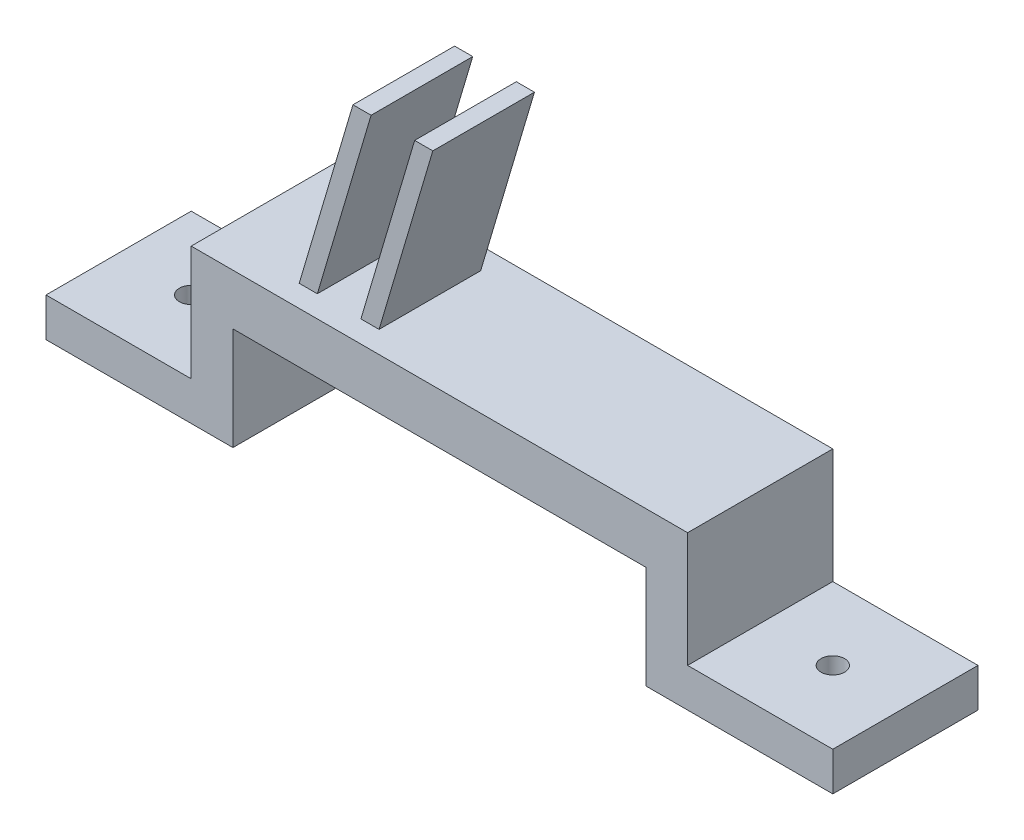
ISO-10303-21;
HEADER;
FILE_DESCRIPTION(('STEP AP214'),'2;1');
FILE_NAME('part.step','',(''),(''),'','','');
FILE_SCHEMA(('AUTOMOTIVE_DESIGN { 1 0 10303 214 1 1 1 1 }'));
ENDSEC;
DATA;
#1=APPLICATION_CONTEXT('core data for automotive mechanical design processes');
#2=APPLICATION_PROTOCOL_DEFINITION('international standard','automotive_design',2000,#1);
#3=PRODUCT_CONTEXT('',#1,'mechanical');
#4=PRODUCT('Part','Part','',(#3));
#5=PRODUCT_RELATED_PRODUCT_CATEGORY('part','',(#4));
#6=PRODUCT_DEFINITION_FORMATION('','',#4);
#7=PRODUCT_DEFINITION_CONTEXT('part definition',#1,'design');
#8=PRODUCT_DEFINITION('design','',#6,#7);
#9=PRODUCT_DEFINITION_SHAPE('','',#8);
#10=(LENGTH_UNIT() NAMED_UNIT(*) SI_UNIT(.MILLI.,.METRE.));
#11=(NAMED_UNIT(*) PLANE_ANGLE_UNIT() SI_UNIT($,.RADIAN.));
#12=(NAMED_UNIT(*) SI_UNIT($,.STERADIAN.) SOLID_ANGLE_UNIT());
#13=UNCERTAINTY_MEASURE_WITH_UNIT(LENGTH_MEASURE(1.E-05),#10,'distance_accuracy_value','');
#14=(GEOMETRIC_REPRESENTATION_CONTEXT(3) GLOBAL_UNCERTAINTY_ASSIGNED_CONTEXT((#13)) GLOBAL_UNIT_ASSIGNED_CONTEXT((#10,
#11,#12)) REPRESENTATION_CONTEXT('',''));
#15=CARTESIAN_POINT('',(0.,0.,0.));
#16=DIRECTION('',(0.,0.,1.));
#17=DIRECTION('',(1.,0.,0.));
#18=AXIS2_PLACEMENT_3D('',#15,#16,#17);
#19=CARTESIAN_POINT('',(-20.1082004555809,0.,16.));
#20=DIRECTION('',(1.,0.,0.));
#21=DIRECTION('',(0.,0.,-1.));
#22=AXIS2_PLACEMENT_3D('',#19,#20,#21);
#23=PLANE('',#22);
#24=DIRECTION('',(0.,0.,-1.));
#25=VECTOR('',#24,1.);
#26=CARTESIAN_POINT('',(-20.1082004555809,12.6633257403189,16.));
#27=LINE('',#26,#25);
#28=CARTESIAN_POINT('',(-20.1082004555809,12.6633257403189,16.));
#29=VERTEX_POINT('',#28);
#30=CARTESIAN_POINT('',(-20.1082004555809,12.6633257403189,0.));
#31=VERTEX_POINT('',#30);
#32=EDGE_CURVE('E362',#29,#31,#27,.T.);
#33=ORIENTED_EDGE('',*,*,#32,.T.);
#34=DIRECTION('',(0.,-1.,0.));
#35=VECTOR('',#34,1.);
#36=CARTESIAN_POINT('',(-20.1082004555809,0.,0.));
#37=LINE('',#36,#35);
#38=CARTESIAN_POINT('',(-20.1082004555809,0.,0.));
#39=VERTEX_POINT('',#38);
#40=EDGE_CURVE('E356',#31,#39,#37,.T.);
#41=ORIENTED_EDGE('',*,*,#40,.T.);
#42=DIRECTION('',(0.,0.,1.));
#43=VECTOR('',#42,1.);
#44=CARTESIAN_POINT('',(-20.1082004555809,0.,0.));
#45=LINE('',#44,#43);
#46=CARTESIAN_POINT('',(-20.1082004555809,0.,16.));
#47=VERTEX_POINT('',#46);
#48=EDGE_CURVE('E311',#39,#47,#45,.T.);
#49=ORIENTED_EDGE('',*,*,#48,.T.);
#50=DIRECTION('',(0.,-1.,0.));
#51=VECTOR('',#50,1.);
#52=CARTESIAN_POINT('',(-20.1082004555809,0.,16.));
#53=LINE('',#52,#51);
#54=EDGE_CURVE('E341',#29,#47,#53,.T.);
#55=ORIENTED_EDGE('',*,*,#54,.F.);
#56=EDGE_LOOP('',(#33,#41,#49,#55));
#57=FACE_BOUND('',#56,.T.);
#58=ADVANCED_FACE('F95',(#57),#23,.F.);
#59=CARTESIAN_POINT('',(-20.1082004555809,32.6633257403189,2.4));
#60=DIRECTION('',(0.,0.,1.));
#61=DIRECTION('',(1.,0.,0.));
#62=AXIS2_PLACEMENT_3D('',#59,#60,#61);
#63=PLANE('',#62);
#64=DIRECTION('',(0.284015344703926,0.958819734868192,0.));
#65=VECTOR('',#64,1.);
#66=CARTESIAN_POINT('',(-4.08945433974437,27.9183569684367,2.4));
#67=LINE('',#66,#65);
#68=CARTESIAN_POINT('',(-8.60820045558087,12.6633257403189,2.4));
#69=VERTEX_POINT('',#68);
#70=CARTESIAN_POINT('',(-2.68393055633918,32.6633257403189,2.4));
#71=VERTEX_POINT('',#70);
#72=EDGE_CURVE('E253',#69,#71,#67,.T.);
#73=ORIENTED_EDGE('',*,*,#72,.F.);
#74=DIRECTION('',(-1.,0.,0.));
#75=VECTOR('',#74,1.);
#76=CARTESIAN_POINT('',(-20.1082004555809,12.6633257403189,2.4));
#77=LINE('',#76,#75);
#78=CARTESIAN_POINT('',(-10.6082004555809,12.6633257403189,2.4));
#79=VERTEX_POINT('',#78);
#80=EDGE_CURVE('E246',#69,#79,#77,.T.);
#81=ORIENTED_EDGE('',*,*,#80,.T.);
#82=DIRECTION('',(0.28401534470392,0.958819734868194,0.));
#83=VECTOR('',#82,1.);
#84=CARTESIAN_POINT('',(-5.92812490768987,28.4629960034518,2.4));
#85=LINE('',#84,#83);
#86=CARTESIAN_POINT('',(-4.68393055633933,32.6633257403189,2.4));
#87=VERTEX_POINT('',#86);
#88=EDGE_CURVE('E229',#79,#87,#85,.T.);
#89=ORIENTED_EDGE('',*,*,#88,.T.);
#90=DIRECTION('',(-1.,0.,0.));
#91=VECTOR('',#90,1.);
#92=CARTESIAN_POINT('',(-20.1082004555809,32.6633257403189,2.4));
#93=LINE('',#92,#91);
#94=EDGE_CURVE('E386',#71,#87,#93,.T.);
#95=ORIENTED_EDGE('',*,*,#94,.F.);
#96=EDGE_LOOP('',(#73,#81,#89,#95));
#97=FACE_BOUND('',#96,.T.);
#98=ADVANCED_FACE('F252',(#97),#63,.F.);
#99=CARTESIAN_POINT('',(-1.80820045558087,12.6633257403189,2.4));
#100=VERTEX_POINT('',#99);
#101=CARTESIAN_POINT('',(-3.80820045558087,12.6633257403189,2.4));
#102=VERTEX_POINT('',#101);
#103=EDGE_CURVE('E254',#100,#102,#77,.T.);
#104=ORIENTED_EDGE('',*,*,#103,.T.);
#105=DIRECTION('',(0.28401534470392,0.958819734868194,0.));
#106=VECTOR('',#105,1.);
#107=CARTESIAN_POINT('',(0.323355023324586,26.6112232844008,2.4));
#108=LINE('',#107,#106);
#109=CARTESIAN_POINT('',(2.11606944366067,32.6633257403189,2.4));
#110=VERTEX_POINT('',#109);
#111=EDGE_CURVE('E389',#102,#110,#108,.T.);
#112=ORIENTED_EDGE('',*,*,#111,.T.);
#113=CARTESIAN_POINT('',(4.11606944366067,32.6633257403189,2.4));
#114=VERTEX_POINT('',#113);
#115=EDGE_CURVE('E379',#114,#110,#93,.T.);
#116=ORIENTED_EDGE('',*,*,#115,.F.);
#117=DIRECTION('',(0.28401534470392,0.958819734868194,0.));
#118=VECTOR('',#117,1.);
#119=CARTESIAN_POINT('',(2.16202559127002,26.0665842493857,2.4));
#120=LINE('',#119,#118);
#121=EDGE_CURVE('E392',#100,#114,#120,.T.);
#122=ORIENTED_EDGE('',*,*,#121,.F.);
#123=EDGE_LOOP('',(#104,#112,#116,#122));
#124=FACE_BOUND('',#123,.T.);
#125=ADVANCED_FACE('F408',(#124),#63,.F.);
#126=CARTESIAN_POINT('',(-20.1082004555809,32.6633257403189,13.6));
#127=DIRECTION('',(0.,0.,-1.));
#128=DIRECTION('',(-1.,0.,0.));
#129=AXIS2_PLACEMENT_3D('',#126,#127,#128);
#130=PLANE('',#129);
#131=DIRECTION('',(-0.284015344703926,-0.958819734868192,0.));
#132=VECTOR('',#131,1.);
#133=CARTESIAN_POINT('',(-4.08945433974437,27.9183569684367,13.6));
#134=LINE('',#133,#132);
#135=CARTESIAN_POINT('',(-2.68393055633918,32.6633257403189,13.6));
#136=VERTEX_POINT('',#135);
#137=CARTESIAN_POINT('',(-8.60820045558087,12.6633257403189,13.6));
#138=VERTEX_POINT('',#137);
#139=EDGE_CURVE('E258',#136,#138,#134,.T.);
#140=ORIENTED_EDGE('',*,*,#139,.F.);
#141=DIRECTION('',(1.,0.,0.));
#142=VECTOR('',#141,1.);
#143=CARTESIAN_POINT('',(-20.1082004555809,32.6633257403189,13.6));
#144=LINE('',#143,#142);
#145=CARTESIAN_POINT('',(-4.68393055633933,32.6633257403189,13.6));
#146=VERTEX_POINT('',#145);
#147=EDGE_CURVE('E270',#146,#136,#144,.T.);
#148=ORIENTED_EDGE('',*,*,#147,.F.);
#149=DIRECTION('',(-0.28401534470392,-0.958819734868194,0.));
#150=VECTOR('',#149,1.);
#151=CARTESIAN_POINT('',(-5.92812490768987,28.4629960034518,13.6));
#152=LINE('',#151,#150);
#153=CARTESIAN_POINT('',(-10.6082004555809,12.6633257403189,13.6));
#154=VERTEX_POINT('',#153);
#155=EDGE_CURVE('E118',#146,#154,#152,.T.);
#156=ORIENTED_EDGE('',*,*,#155,.T.);
#157=DIRECTION('',(1.,0.,0.));
#158=VECTOR('',#157,1.);
#159=CARTESIAN_POINT('',(-20.1082004555809,12.6633257403189,13.6));
#160=LINE('',#159,#158);
#161=EDGE_CURVE('E248',#154,#138,#160,.T.);
#162=ORIENTED_EDGE('',*,*,#161,.T.);
#163=EDGE_LOOP('',(#140,#148,#156,#162));
#164=FACE_BOUND('',#163,.T.);
#165=ADVANCED_FACE('F579',(#164),#130,.F.);
#166=CARTESIAN_POINT('',(2.11606944366067,32.6633257403189,13.6));
#167=VERTEX_POINT('',#166);
#168=CARTESIAN_POINT('',(4.11606944366067,32.6633257403189,13.6));
#169=VERTEX_POINT('',#168);
#170=EDGE_CURVE('E262',#167,#169,#144,.T.);
#171=ORIENTED_EDGE('',*,*,#170,.F.);
#172=DIRECTION('',(-0.28401534470392,-0.958819734868194,0.));
#173=VECTOR('',#172,1.);
#174=CARTESIAN_POINT('',(0.323355023324586,26.6112232844008,13.6));
#175=LINE('',#174,#173);
#176=CARTESIAN_POINT('',(-3.80820045558087,12.6633257403189,13.6));
#177=VERTEX_POINT('',#176);
#178=EDGE_CURVE('E110',#167,#177,#175,.T.);
#179=ORIENTED_EDGE('',*,*,#178,.T.);
#180=CARTESIAN_POINT('',(-1.80820045558087,12.6633257403189,13.6));
#181=VERTEX_POINT('',#180);
#182=EDGE_CURVE('E257',#177,#181,#160,.T.);
#183=ORIENTED_EDGE('',*,*,#182,.T.);
#184=DIRECTION('',(-0.28401534470392,-0.958819734868194,0.));
#185=VECTOR('',#184,1.);
#186=CARTESIAN_POINT('',(2.16202559127002,26.0665842493857,13.6));
#187=LINE('',#186,#185);
#188=EDGE_CURVE('E238',#169,#181,#187,.T.);
#189=ORIENTED_EDGE('',*,*,#188,.F.);
#190=EDGE_LOOP('',(#171,#179,#183,#189));
#191=FACE_BOUND('',#190,.T.);
#192=ADVANCED_FACE('F383',(#191),#130,.F.);
#193=CARTESIAN_POINT('',(0.,32.6633257403189,0.));
#194=DIRECTION('',(0.,-1.,0.));
#195=DIRECTION('',(0.,0.,-1.));
#196=AXIS2_PLACEMENT_3D('',#193,#194,#195);
#197=PLANE('',#196);
#198=DIRECTION('',(0.,0.,1.));
#199=VECTOR('',#198,1.);
#200=CARTESIAN_POINT('',(-2.68393055633918,32.6633257403189,0.));
#201=LINE('',#200,#199);
#202=EDGE_CURVE('E12',#71,#136,#201,.T.);
#203=ORIENTED_EDGE('',*,*,#202,.F.);
#204=ORIENTED_EDGE('',*,*,#94,.T.);
#205=DIRECTION('',(0.,0.,1.));
#206=VECTOR('',#205,1.);
#207=CARTESIAN_POINT('',(-4.68393055633933,32.6633257403189,0.));
#208=LINE('',#207,#206);
#209=EDGE_CURVE('E233',#87,#146,#208,.T.);
#210=ORIENTED_EDGE('',*,*,#209,.T.);
#211=ORIENTED_EDGE('',*,*,#147,.T.);
#212=EDGE_LOOP('',(#203,#204,#210,#211));
#213=FACE_BOUND('',#212,.T.);
#214=ADVANCED_FACE('F598',(#213),#197,.F.);
#215=ORIENTED_EDGE('',*,*,#115,.T.);
#216=DIRECTION('',(0.,0.,1.));
#217=VECTOR('',#216,1.);
#218=CARTESIAN_POINT('',(2.11606944366067,32.6633257403189,0.));
#219=LINE('',#218,#217);
#220=EDGE_CURVE('E103',#110,#167,#219,.T.);
#221=ORIENTED_EDGE('',*,*,#220,.T.);
#222=ORIENTED_EDGE('',*,*,#170,.T.);
#223=DIRECTION('',(0.,0.,1.));
#224=VECTOR('',#223,1.);
#225=CARTESIAN_POINT('',(4.11606944366067,32.6633257403189,0.));
#226=LINE('',#225,#224);
#227=EDGE_CURVE('E371',#114,#169,#226,.T.);
#228=ORIENTED_EDGE('',*,*,#227,.F.);
#229=EDGE_LOOP('',(#215,#221,#222,#228));
#230=FACE_BOUND('',#229,.T.);
#231=ADVANCED_FACE('F376',(#230),#197,.F.);
#232=CARTESIAN_POINT('',(29.9917995444191,0.,16.));
#233=DIRECTION('',(1.,0.,0.));
#234=DIRECTION('',(0.,0.,-1.));
#235=AXIS2_PLACEMENT_3D('',#232,#233,#234);
#236=PLANE('',#235);
#237=DIRECTION('',(0.,-1.,0.));
#238=VECTOR('',#237,1.);
#239=CARTESIAN_POINT('',(29.9917995444191,0.,16.));
#240=LINE('',#239,#238);
#241=CARTESIAN_POINT('',(29.9917995444191,7.06332574031891,16.));
#242=VERTEX_POINT('',#241);
#243=CARTESIAN_POINT('',(29.9917995444191,-4.26667425968109,16.));
#244=VERTEX_POINT('',#243);
#245=EDGE_CURVE('E331',#242,#244,#240,.T.);
#246=ORIENTED_EDGE('',*,*,#245,.F.);
#247=DIRECTION('',(0.,0.,1.));
#248=VECTOR('',#247,1.);
#249=CARTESIAN_POINT('',(29.9917995444191,7.06332574031891,16.));
#250=LINE('',#249,#248);
#251=CARTESIAN_POINT('',(29.9917995444191,7.06332574031891,0.));
#252=VERTEX_POINT('',#251);
#253=EDGE_CURVE('E273',#252,#242,#250,.T.);
#254=ORIENTED_EDGE('',*,*,#253,.F.);
#255=DIRECTION('',(0.,-1.,0.));
#256=VECTOR('',#255,1.);
#257=CARTESIAN_POINT('',(29.9917995444191,0.,0.));
#258=LINE('',#257,#256);
#259=CARTESIAN_POINT('',(29.9917995444191,-4.26667425968109,0.));
#260=VERTEX_POINT('',#259);
#261=EDGE_CURVE('E330',#252,#260,#258,.T.);
#262=ORIENTED_EDGE('',*,*,#261,.T.);
#263=DIRECTION('',(0.,0.,-1.));
#264=VECTOR('',#263,1.);
#265=CARTESIAN_POINT('',(29.9917995444191,-4.26667425968109,16.));
#266=LINE('',#265,#264);
#267=EDGE_CURVE('E367',#244,#260,#266,.T.);
#268=ORIENTED_EDGE('',*,*,#267,.F.);
#269=EDGE_LOOP('',(#246,#254,#262,#268));
#270=FACE_BOUND('',#269,.T.);
#271=ADVANCED_FACE('F97',(#270),#236,.F.);
#272=CARTESIAN_POINT('',(0.,-4.26667425968109,16.));
#273=DIRECTION('',(0.,1.,0.));
#274=DIRECTION('',(0.,0.,1.));
#275=AXIS2_PLACEMENT_3D('',#272,#273,#274);
#276=PLANE('',#275);
#277=CARTESIAN_POINT('',(42.5917995444191,-4.26667425968109,8.));
#278=DIRECTION('',(0.,1.,0.));
#279=DIRECTION('',(0.,0.,1.));
#280=AXIS2_PLACEMENT_3D('',#277,#278,#279);
#281=CIRCLE('',#280,1.3);
#282=CARTESIAN_POINT('',(42.5917995444191,-4.26667425968109,9.30000000000001));
#283=VERTEX_POINT('',#282);
#284=EDGE_CURVE('E288',#283,#283,#281,.T.);
#285=ORIENTED_EDGE('',*,*,#284,.T.);
#286=EDGE_LOOP('',(#285));
#287=FACE_BOUND('',#286,.T.);
#288=DIRECTION('',(1.,0.,0.));
#289=VECTOR('',#288,1.);
#290=CARTESIAN_POINT('',(0.,-4.26667425968109,0.));
#291=LINE('',#290,#289);
#292=CARTESIAN_POINT('',(50.5917995444191,-4.26667425968109,0.));
#293=VERTEX_POINT('',#292);
#294=EDGE_CURVE('E348',#260,#293,#291,.T.);
#295=ORIENTED_EDGE('',*,*,#294,.T.);
#296=DIRECTION('',(0.,0.,-1.));
#297=VECTOR('',#296,1.);
#298=CARTESIAN_POINT('',(50.5917995444191,-4.26667425968109,0.));
#299=LINE('',#298,#297);
#300=CARTESIAN_POINT('',(50.5917995444191,-4.26667425968109,16.));
#301=VERTEX_POINT('',#300);
#302=EDGE_CURVE('E300',#301,#293,#299,.T.);
#303=ORIENTED_EDGE('',*,*,#302,.F.);
#304=DIRECTION('',(1.,0.,0.));
#305=VECTOR('',#304,1.);
#306=CARTESIAN_POINT('',(0.,-4.26667425968109,16.));
#307=LINE('',#306,#305);
#308=EDGE_CURVE('E333',#244,#301,#307,.T.);
#309=ORIENTED_EDGE('',*,*,#308,.F.);
#310=ORIENTED_EDGE('',*,*,#267,.T.);
#311=EDGE_LOOP('',(#295,#303,#309,#310));
#312=FACE_BOUND('',#311,.T.);
#313=ADVANCED_FACE('F434',(#287,#312),#276,.F.);
#314=CARTESIAN_POINT('',(34.5917995444191,0.,16.));
#315=DIRECTION('',(1.,0.,0.));
#316=DIRECTION('',(0.,0.,-1.));
#317=AXIS2_PLACEMENT_3D('',#314,#315,#316);
#318=PLANE('',#317);
#319=DIRECTION('',(0.,0.,1.));
#320=VECTOR('',#319,1.);
#321=CARTESIAN_POINT('',(34.5917995444191,0.,0.));
#322=LINE('',#321,#320);
#323=CARTESIAN_POINT('',(34.5917995444191,0.,0.));
#324=VERTEX_POINT('',#323);
#325=CARTESIAN_POINT('',(34.5917995444191,0.,16.));
#326=VERTEX_POINT('',#325);
#327=EDGE_CURVE('E291',#324,#326,#322,.T.);
#328=ORIENTED_EDGE('',*,*,#327,.F.);
#329=DIRECTION('',(0.,-1.,0.));
#330=VECTOR('',#329,1.);
#331=CARTESIAN_POINT('',(34.5917995444191,0.,0.));
#332=LINE('',#331,#330);
#333=CARTESIAN_POINT('',(34.5917995444191,12.6633257403189,0.));
#334=VERTEX_POINT('',#333);
#335=EDGE_CURVE('E350',#334,#324,#332,.T.);
#336=ORIENTED_EDGE('',*,*,#335,.F.);
#337=DIRECTION('',(0.,0.,-1.));
#338=VECTOR('',#337,1.);
#339=CARTESIAN_POINT('',(34.5917995444191,12.6633257403189,16.));
#340=LINE('',#339,#338);
#341=CARTESIAN_POINT('',(34.5917995444191,12.6633257403189,16.));
#342=VERTEX_POINT('',#341);
#343=EDGE_CURVE('E364',#342,#334,#340,.T.);
#344=ORIENTED_EDGE('',*,*,#343,.F.);
#345=DIRECTION('',(0.,-1.,0.));
#346=VECTOR('',#345,1.);
#347=CARTESIAN_POINT('',(34.5917995444191,0.,16.));
#348=LINE('',#347,#346);
#349=EDGE_CURVE('E336',#342,#326,#348,.T.);
#350=ORIENTED_EDGE('',*,*,#349,.T.);
#351=EDGE_LOOP('',(#328,#336,#344,#350));
#352=FACE_BOUND('',#351,.T.);
#353=ADVANCED_FACE('F432',(#352),#318,.T.);
#354=CARTESIAN_POINT('',(0.,12.6633257403189,16.));
#355=DIRECTION('',(0.,1.,0.));
#356=DIRECTION('',(0.,0.,1.));
#357=AXIS2_PLACEMENT_3D('',#354,#355,#356);
#358=PLANE('',#357);
#359=DIRECTION('',(0.,0.,1.));
#360=VECTOR('',#359,1.);
#361=CARTESIAN_POINT('',(-8.60820045558087,12.6633257403189,-4.));
#362=LINE('',#361,#360);
#363=EDGE_CURVE('E249',#69,#138,#362,.T.);
#364=ORIENTED_EDGE('',*,*,#363,.T.);
#365=ORIENTED_EDGE('',*,*,#161,.F.);
#366=DIRECTION('',(0.,0.,1.));
#367=VECTOR('',#366,1.);
#368=CARTESIAN_POINT('',(-10.6082004555809,12.6633257403189,-4.));
#369=LINE('',#368,#367);
#370=EDGE_CURVE('E232',#79,#154,#369,.T.);
#371=ORIENTED_EDGE('',*,*,#370,.F.);
#372=ORIENTED_EDGE('',*,*,#80,.F.);
#373=EDGE_LOOP('',(#364,#365,#371,#372));
#374=FACE_BOUND('',#373,.T.);
#375=ORIENTED_EDGE('',*,*,#182,.F.);
#376=DIRECTION('',(0.,0.,1.));
#377=VECTOR('',#376,1.);
#378=CARTESIAN_POINT('',(-3.80820045558087,12.6633257403189,-4.));
#379=LINE('',#378,#377);
#380=EDGE_CURVE('E396',#102,#177,#379,.T.);
#381=ORIENTED_EDGE('',*,*,#380,.F.);
#382=ORIENTED_EDGE('',*,*,#103,.F.);
#383=DIRECTION('',(0.,0.,1.));
#384=VECTOR('',#383,1.);
#385=CARTESIAN_POINT('',(-1.80820045558087,12.6633257403189,-4.));
#386=LINE('',#385,#384);
#387=EDGE_CURVE('E398',#100,#181,#386,.T.);
#388=ORIENTED_EDGE('',*,*,#387,.T.);
#389=EDGE_LOOP('',(#375,#381,#382,#388));
#390=FACE_BOUND('',#389,.T.);
#391=DIRECTION('',(1.,0.,0.));
#392=VECTOR('',#391,1.);
#393=CARTESIAN_POINT('',(0.,12.6633257403189,16.));
#394=LINE('',#393,#392);
#395=EDGE_CURVE('E339',#29,#342,#394,.T.);
#396=ORIENTED_EDGE('',*,*,#395,.T.);
#397=ORIENTED_EDGE('',*,*,#343,.T.);
#398=DIRECTION('',(1.,0.,0.));
#399=VECTOR('',#398,1.);
#400=CARTESIAN_POINT('',(0.,12.6633257403189,0.));
#401=LINE('',#400,#399);
#402=EDGE_CURVE('E354',#31,#334,#401,.T.);
#403=ORIENTED_EDGE('',*,*,#402,.F.);
#404=ORIENTED_EDGE('',*,*,#32,.F.);
#405=EDGE_LOOP('',(#396,#397,#403,#404));
#406=FACE_BOUND('',#405,.T.);
#407=ADVANCED_FACE('F244',(#374,#390,#406),#358,.T.);
#408=CARTESIAN_POINT('',(-28.1082004555809,-4.26667425968109,8.));
#409=DIRECTION('',(0.,1.,0.));
#410=DIRECTION('',(0.,0.,1.));
#411=AXIS2_PLACEMENT_3D('',#408,#409,#410);
#412=CIRCLE('',#411,1.3);
#413=CARTESIAN_POINT('',(-28.1082004555809,-4.26667425968109,9.3));
#414=VERTEX_POINT('',#413);
#415=EDGE_CURVE('E282',#414,#414,#412,.T.);
#416=ORIENTED_EDGE('',*,*,#415,.T.);
#417=EDGE_LOOP('',(#416));
#418=FACE_BOUND('',#417,.T.);
#419=CARTESIAN_POINT('',(-36.1082004555809,-4.26667425968109,0.));
#420=VERTEX_POINT('',#419);
#421=CARTESIAN_POINT('',(-15.5082004555809,-4.26667425968109,0.));
#422=VERTEX_POINT('',#421);
#423=EDGE_CURVE('E351',#420,#422,#291,.T.);
#424=ORIENTED_EDGE('',*,*,#423,.T.);
#425=DIRECTION('',(0.,0.,-1.));
#426=VECTOR('',#425,1.);
#427=CARTESIAN_POINT('',(-15.5082004555809,-4.26667425968109,16.));
#428=LINE('',#427,#426);
#429=CARTESIAN_POINT('',(-15.5082004555809,-4.26667425968109,16.));
#430=VERTEX_POINT('',#429);
#431=EDGE_CURVE('E346',#430,#422,#428,.T.);
#432=ORIENTED_EDGE('',*,*,#431,.F.);
#433=CARTESIAN_POINT('',(-36.1082004555809,-4.26667425968109,16.));
#434=VERTEX_POINT('',#433);
#435=EDGE_CURVE('E337',#434,#430,#307,.T.);
#436=ORIENTED_EDGE('',*,*,#435,.F.);
#437=DIRECTION('',(0.,0.,1.));
#438=VECTOR('',#437,1.);
#439=CARTESIAN_POINT('',(-36.1082004555809,-4.26667425968109,0.));
#440=LINE('',#439,#438);
#441=EDGE_CURVE('E312',#420,#434,#440,.T.);
#442=ORIENTED_EDGE('',*,*,#441,.F.);
#443=EDGE_LOOP('',(#424,#432,#436,#442));
#444=FACE_BOUND('',#443,.T.);
#445=ADVANCED_FACE('F429',(#418,#444),#276,.F.);
#446=CARTESIAN_POINT('',(-15.5082004555809,0.,16.));
#447=DIRECTION('',(1.,0.,0.));
#448=DIRECTION('',(0.,0.,-1.));
#449=AXIS2_PLACEMENT_3D('',#446,#447,#448);
#450=PLANE('',#449);
#451=DIRECTION('',(0.,0.,-1.));
#452=VECTOR('',#451,1.);
#453=CARTESIAN_POINT('',(-15.5082004555809,7.06332574031891,16.));
#454=LINE('',#453,#452);
#455=CARTESIAN_POINT('',(-15.5082004555809,7.06332574031891,16.));
#456=VERTEX_POINT('',#455);
#457=CARTESIAN_POINT('',(-15.5082004555809,7.06332574031891,0.));
#458=VERTEX_POINT('',#457);
#459=EDGE_CURVE('E266',#456,#458,#454,.T.);
#460=ORIENTED_EDGE('',*,*,#459,.F.);
#461=DIRECTION('',(0.,-1.,0.));
#462=VECTOR('',#461,1.);
#463=CARTESIAN_POINT('',(-15.5082004555809,0.,16.));
#464=LINE('',#463,#462);
#465=EDGE_CURVE('E344',#456,#430,#464,.T.);
#466=ORIENTED_EDGE('',*,*,#465,.T.);
#467=ORIENTED_EDGE('',*,*,#431,.T.);
#468=DIRECTION('',(0.,-1.,0.));
#469=VECTOR('',#468,1.);
#470=CARTESIAN_POINT('',(-15.5082004555809,0.,0.));
#471=LINE('',#470,#469);
#472=EDGE_CURVE('E334',#458,#422,#471,.T.);
#473=ORIENTED_EDGE('',*,*,#472,.F.);
#474=EDGE_LOOP('',(#460,#466,#467,#473));
#475=FACE_BOUND('',#474,.T.);
#476=ADVANCED_FACE('F473',(#475),#450,.T.);
#477=CARTESIAN_POINT('',(0.,0.,16.));
#478=DIRECTION('',(0.,0.,1.));
#479=DIRECTION('',(1.,0.,0.));
#480=AXIS2_PLACEMENT_3D('',#477,#478,#479);
#481=PLANE('',#480);
#482=ORIENTED_EDGE('',*,*,#465,.F.);
#483=DIRECTION('',(-1.,0.,0.));
#484=VECTOR('',#483,1.);
#485=CARTESIAN_POINT('',(-15.5082004555809,7.06332574031891,16.));
#486=LINE('',#485,#484);
#487=EDGE_CURVE('E276',#242,#456,#486,.T.);
#488=ORIENTED_EDGE('',*,*,#487,.F.);
#489=ORIENTED_EDGE('',*,*,#245,.T.);
#490=ORIENTED_EDGE('',*,*,#308,.T.);
#491=DIRECTION('',(0.,-1.,0.));
#492=VECTOR('',#491,1.);
#493=CARTESIAN_POINT('',(50.5917995444191,0.,16.));
#494=LINE('',#493,#492);
#495=CARTESIAN_POINT('',(50.5917995444191,0.,16.));
#496=VERTEX_POINT('',#495);
#497=EDGE_CURVE('E297',#496,#301,#494,.T.);
#498=ORIENTED_EDGE('',*,*,#497,.F.);
#499=DIRECTION('',(-1.,0.,0.));
#500=VECTOR('',#499,1.);
#501=CARTESIAN_POINT('',(50.5917995444191,0.,16.));
#502=LINE('',#501,#500);
#503=EDGE_CURVE('E303',#496,#326,#502,.T.);
#504=ORIENTED_EDGE('',*,*,#503,.T.);
#505=ORIENTED_EDGE('',*,*,#349,.F.);
#506=ORIENTED_EDGE('',*,*,#395,.F.);
#507=ORIENTED_EDGE('',*,*,#54,.T.);
#508=DIRECTION('',(1.,0.,0.));
#509=VECTOR('',#508,1.);
#510=CARTESIAN_POINT('',(-36.1082004555809,0.,16.));
#511=LINE('',#510,#509);
#512=CARTESIAN_POINT('',(-36.1082004555809,0.,16.));
#513=VERTEX_POINT('',#512);
#514=EDGE_CURVE('E328',#513,#47,#511,.T.);
#515=ORIENTED_EDGE('',*,*,#514,.F.);
#516=DIRECTION('',(0.,-1.,0.));
#517=VECTOR('',#516,1.);
#518=CARTESIAN_POINT('',(-36.1082004555809,0.,16.));
#519=LINE('',#518,#517);
#520=EDGE_CURVE('E315',#513,#434,#519,.T.);
#521=ORIENTED_EDGE('',*,*,#520,.T.);
#522=ORIENTED_EDGE('',*,*,#435,.T.);
#523=EDGE_LOOP('',(#482,#488,#489,#490,#498,#504,#505,#506,#507,#515,#521,#522));
#524=FACE_BOUND('',#523,.T.);
#525=ADVANCED_FACE('F469',(#524),#481,.T.);
#526=CARTESIAN_POINT('',(0.,0.,0.));
#527=DIRECTION('',(0.,0.,1.));
#528=DIRECTION('',(1.,0.,0.));
#529=AXIS2_PLACEMENT_3D('',#526,#527,#528);
#530=PLANE('',#529);
#531=DIRECTION('',(1.,0.,0.));
#532=VECTOR('',#531,1.);
#533=CARTESIAN_POINT('',(-15.5082004555809,7.06332574031891,0.));
#534=LINE('',#533,#532);
#535=EDGE_CURVE('E269',#458,#252,#534,.T.);
#536=ORIENTED_EDGE('',*,*,#535,.F.);
#537=ORIENTED_EDGE('',*,*,#472,.T.);
#538=ORIENTED_EDGE('',*,*,#423,.F.);
#539=DIRECTION('',(0.,-1.,0.));
#540=VECTOR('',#539,1.);
#541=CARTESIAN_POINT('',(-36.1082004555809,0.,0.));
#542=LINE('',#541,#540);
#543=CARTESIAN_POINT('',(-36.1082004555809,0.,0.));
#544=VERTEX_POINT('',#543);
#545=EDGE_CURVE('E321',#544,#420,#542,.T.);
#546=ORIENTED_EDGE('',*,*,#545,.F.);
#547=DIRECTION('',(1.,0.,0.));
#548=VECTOR('',#547,1.);
#549=CARTESIAN_POINT('',(-36.1082004555809,0.,0.));
#550=LINE('',#549,#548);
#551=EDGE_CURVE('E324',#544,#39,#550,.T.);
#552=ORIENTED_EDGE('',*,*,#551,.T.);
#553=ORIENTED_EDGE('',*,*,#40,.F.);
#554=ORIENTED_EDGE('',*,*,#402,.T.);
#555=ORIENTED_EDGE('',*,*,#335,.T.);
#556=DIRECTION('',(-1.,0.,0.));
#557=VECTOR('',#556,1.);
#558=CARTESIAN_POINT('',(50.5917995444191,0.,0.));
#559=LINE('',#558,#557);
#560=CARTESIAN_POINT('',(50.5917995444191,0.,0.));
#561=VERTEX_POINT('',#560);
#562=EDGE_CURVE('E308',#561,#324,#559,.T.);
#563=ORIENTED_EDGE('',*,*,#562,.F.);
#564=DIRECTION('',(0.,1.,0.));
#565=VECTOR('',#564,1.);
#566=CARTESIAN_POINT('',(50.5917995444191,0.,0.));
#567=LINE('',#566,#565);
#568=EDGE_CURVE('E292',#293,#561,#567,.T.);
#569=ORIENTED_EDGE('',*,*,#568,.F.);
#570=ORIENTED_EDGE('',*,*,#294,.F.);
#571=ORIENTED_EDGE('',*,*,#261,.F.);
#572=EDGE_LOOP('',(#536,#537,#538,#546,#552,#553,#554,#555,#563,#569,#570,#571));
#573=FACE_BOUND('',#572,.T.);
#574=ADVANCED_FACE('F449',(#573),#530,.F.);
#575=CARTESIAN_POINT('',(-36.1082004555809,0.,0.));
#576=DIRECTION('',(0.,1.,0.));
#577=DIRECTION('',(0.,0.,1.));
#578=AXIS2_PLACEMENT_3D('',#575,#576,#577);
#579=PLANE('',#578);
#580=CARTESIAN_POINT('',(-28.1082004555809,0.,8.));
#581=DIRECTION('',(0.,1.,0.));
#582=DIRECTION('',(0.,0.,1.));
#583=AXIS2_PLACEMENT_3D('',#580,#581,#582);
#584=CIRCLE('',#583,1.3);
#585=CARTESIAN_POINT('',(-28.1082004555809,0.,9.3));
#586=VERTEX_POINT('',#585);
#587=EDGE_CURVE('E279',#586,#586,#584,.T.);
#588=ORIENTED_EDGE('',*,*,#587,.F.);
#589=EDGE_LOOP('',(#588));
#590=FACE_BOUND('',#589,.T.);
#591=ORIENTED_EDGE('',*,*,#48,.F.);
#592=ORIENTED_EDGE('',*,*,#551,.F.);
#593=DIRECTION('',(0.,0.,1.));
#594=VECTOR('',#593,1.);
#595=CARTESIAN_POINT('',(-36.1082004555809,0.,0.));
#596=LINE('',#595,#594);
#597=EDGE_CURVE('E318',#544,#513,#596,.T.);
#598=ORIENTED_EDGE('',*,*,#597,.T.);
#599=ORIENTED_EDGE('',*,*,#514,.T.);
#600=EDGE_LOOP('',(#591,#592,#598,#599));
#601=FACE_BOUND('',#600,.T.);
#602=ADVANCED_FACE('F495',(#590,#601),#579,.T.);
#603=CARTESIAN_POINT('',(-36.1082004555809,0.,0.));
#604=DIRECTION('',(1.,0.,0.));
#605=DIRECTION('',(0.,0.,-1.));
#606=AXIS2_PLACEMENT_3D('',#603,#604,#605);
#607=PLANE('',#606);
#608=ORIENTED_EDGE('',*,*,#441,.T.);
#609=ORIENTED_EDGE('',*,*,#520,.F.);
#610=ORIENTED_EDGE('',*,*,#597,.F.);
#611=ORIENTED_EDGE('',*,*,#545,.T.);
#612=EDGE_LOOP('',(#608,#609,#610,#611));
#613=FACE_BOUND('',#612,.T.);
#614=ADVANCED_FACE('F480',(#613),#607,.F.);
#615=CARTESIAN_POINT('',(50.5917995444191,0.,0.));
#616=DIRECTION('',(0.,-1.,0.));
#617=DIRECTION('',(0.,0.,-1.));
#618=AXIS2_PLACEMENT_3D('',#615,#616,#617);
#619=PLANE('',#618);
#620=CARTESIAN_POINT('',(42.5917995444191,0.,8.));
#621=DIRECTION('',(0.,1.,0.));
#622=DIRECTION('',(0.,0.,1.));
#623=AXIS2_PLACEMENT_3D('',#620,#621,#622);
#624=CIRCLE('',#623,1.3);
#625=CARTESIAN_POINT('',(42.5917995444191,0.,9.30000000000001));
#626=VERTEX_POINT('',#625);
#627=EDGE_CURVE('E285',#626,#626,#624,.T.);
#628=ORIENTED_EDGE('',*,*,#627,.F.);
#629=EDGE_LOOP('',(#628));
#630=FACE_BOUND('',#629,.T.);
#631=ORIENTED_EDGE('',*,*,#327,.T.);
#632=ORIENTED_EDGE('',*,*,#503,.F.);
#633=DIRECTION('',(0.,0.,1.));
#634=VECTOR('',#633,1.);
#635=CARTESIAN_POINT('',(50.5917995444191,0.,0.));
#636=LINE('',#635,#634);
#637=EDGE_CURVE('E295',#561,#496,#636,.T.);
#638=ORIENTED_EDGE('',*,*,#637,.F.);
#639=ORIENTED_EDGE('',*,*,#562,.T.);
#640=EDGE_LOOP('',(#631,#632,#638,#639));
#641=FACE_BOUND('',#640,.T.);
#642=ADVANCED_FACE('F453',(#630,#641),#619,.F.);
#643=CARTESIAN_POINT('',(50.5917995444191,0.,0.));
#644=DIRECTION('',(-1.,0.,0.));
#645=DIRECTION('',(0.,0.,1.));
#646=AXIS2_PLACEMENT_3D('',#643,#644,#645);
#647=PLANE('',#646);
#648=ORIENTED_EDGE('',*,*,#568,.T.);
#649=ORIENTED_EDGE('',*,*,#637,.T.);
#650=ORIENTED_EDGE('',*,*,#497,.T.);
#651=ORIENTED_EDGE('',*,*,#302,.T.);
#652=EDGE_LOOP('',(#648,#649,#650,#651));
#653=FACE_BOUND('',#652,.T.);
#654=ADVANCED_FACE('F456',(#653),#647,.F.);
#655=CARTESIAN_POINT('',(42.5917995444191,0.,8.));
#656=DIRECTION('',(0.,1.,0.));
#657=DIRECTION('',(0.,0.,1.));
#658=AXIS2_PLACEMENT_3D('',#655,#656,#657);
#659=CYLINDRICAL_SURFACE('',#658,1.3);
#660=ORIENTED_EDGE('',*,*,#284,.F.);
#661=EDGE_LOOP('',(#660));
#662=FACE_BOUND('',#661,.T.);
#663=ORIENTED_EDGE('',*,*,#627,.T.);
#664=EDGE_LOOP('',(#663));
#665=FACE_BOUND('',#664,.T.);
#666=ADVANCED_FACE('F491',(#662,#665),#659,.F.);
#667=CARTESIAN_POINT('',(-28.1082004555809,0.,8.));
#668=DIRECTION('',(0.,1.,0.));
#669=DIRECTION('',(0.,0.,1.));
#670=AXIS2_PLACEMENT_3D('',#667,#668,#669);
#671=CYLINDRICAL_SURFACE('',#670,1.3);
#672=ORIENTED_EDGE('',*,*,#415,.F.);
#673=EDGE_LOOP('',(#672));
#674=FACE_BOUND('',#673,.T.);
#675=ORIENTED_EDGE('',*,*,#587,.T.);
#676=EDGE_LOOP('',(#675));
#677=FACE_BOUND('',#676,.T.);
#678=ADVANCED_FACE('F488',(#674,#677),#671,.F.);
#679=CARTESIAN_POINT('',(0.,7.06332574031891,0.));
#680=DIRECTION('',(0.,-1.,0.));
#681=DIRECTION('',(0.,0.,-1.));
#682=AXIS2_PLACEMENT_3D('',#679,#680,#681);
#683=PLANE('',#682);
#684=ORIENTED_EDGE('',*,*,#459,.T.);
#685=ORIENTED_EDGE('',*,*,#535,.T.);
#686=ORIENTED_EDGE('',*,*,#253,.T.);
#687=ORIENTED_EDGE('',*,*,#487,.T.);
#688=EDGE_LOOP('',(#684,#685,#686,#687));
#689=FACE_BOUND('',#688,.T.);
#690=ADVANCED_FACE('F466',(#689),#683,.T.);
#691=CARTESIAN_POINT('',(-13.200963733915,3.91030360449059,-4.));
#692=DIRECTION('',(0.958819734868194,-0.28401534470392,0.));
#693=DIRECTION('',(0.28401534470392,0.958819734868194,0.));
#694=AXIS2_PLACEMENT_3D('',#691,#692,#693);
#695=PLANE('',#694);
#696=ORIENTED_EDGE('',*,*,#370,.T.);
#697=ORIENTED_EDGE('',*,*,#155,.F.);
#698=ORIENTED_EDGE('',*,*,#209,.F.);
#699=ORIENTED_EDGE('',*,*,#88,.F.);
#700=EDGE_LOOP('',(#696,#697,#698,#699));
#701=FACE_BOUND('',#700,.T.);
#702=ADVANCED_FACE('F231',(#701),#695,.F.);
#703=CARTESIAN_POINT('',(-5.11081323495512,1.5138918504245,-4.));
#704=DIRECTION('',(0.958819734868194,-0.28401534470392,0.));
#705=DIRECTION('',(0.28401534470392,0.958819734868194,0.));
#706=AXIS2_PLACEMENT_3D('',#703,#704,#705);
#707=PLANE('',#706);
#708=ORIENTED_EDGE('',*,*,#121,.T.);
#709=ORIENTED_EDGE('',*,*,#227,.T.);
#710=ORIENTED_EDGE('',*,*,#188,.T.);
#711=ORIENTED_EDGE('',*,*,#387,.F.);
#712=EDGE_LOOP('',(#708,#709,#710,#711));
#713=FACE_BOUND('',#712,.T.);
#714=ADVANCED_FACE('F406',(#713),#707,.T.);
#715=CARTESIAN_POINT('',(-11.3622931659696,3.36566456947567,-4.));
#716=DIRECTION('',(0.958819734868192,-0.284015344703926,0.));
#717=DIRECTION('',(0.284015344703926,0.958819734868192,0.));
#718=AXIS2_PLACEMENT_3D('',#715,#716,#717);
#719=PLANE('',#718);
#720=ORIENTED_EDGE('',*,*,#72,.T.);
#721=ORIENTED_EDGE('',*,*,#202,.T.);
#722=ORIENTED_EDGE('',*,*,#139,.T.);
#723=ORIENTED_EDGE('',*,*,#363,.F.);
#724=EDGE_LOOP('',(#720,#721,#722,#723));
#725=FACE_BOUND('',#724,.T.);
#726=ADVANCED_FACE('F411',(#725),#719,.T.);
#727=CARTESIAN_POINT('',(-6.94948380290055,2.05853088543952,-4.));
#728=DIRECTION('',(0.958819734868194,-0.28401534470392,0.));
#729=DIRECTION('',(0.28401534470392,0.958819734868194,0.));
#730=AXIS2_PLACEMENT_3D('',#727,#728,#729);
#731=PLANE('',#730);
#732=ORIENTED_EDGE('',*,*,#380,.T.);
#733=ORIENTED_EDGE('',*,*,#178,.F.);
#734=ORIENTED_EDGE('',*,*,#220,.F.);
#735=ORIENTED_EDGE('',*,*,#111,.F.);
#736=EDGE_LOOP('',(#732,#733,#734,#735));
#737=FACE_BOUND('',#736,.T.);
#738=ADVANCED_FACE('F409',(#737),#731,.F.);
#739=CLOSED_SHELL('',(#58,#98,#125,#165,#192,#214,#231,#271,#313,#353,#407,#445,#476,#525,#574,
#602,#614,#642,#654,#666,#678,#690,#702,#714,#726,#738));
#740=MANIFOLD_SOLID_BREP('B2',#739);
#741=ADVANCED_BREP_SHAPE_REPRESENTATION('',(#18,#740),#14);
#742=SHAPE_DEFINITION_REPRESENTATION(#9,#741);
ENDSEC;
END-ISO-10303-21;
